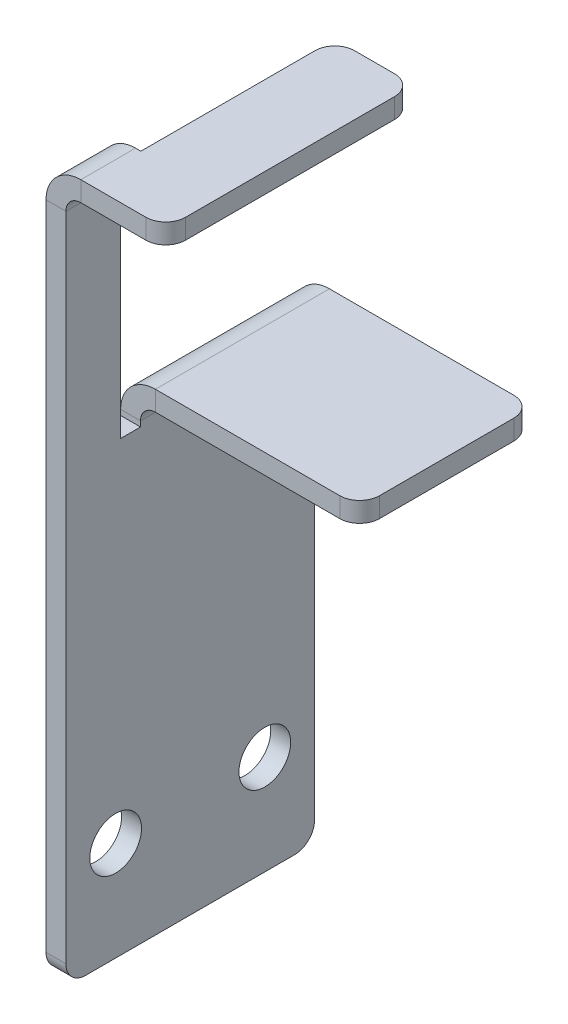
ISO-10303-21;
HEADER;
FILE_DESCRIPTION(('STEP AP214'),'2;1');
FILE_NAME('part.step','',(''),(''),'','','');
FILE_SCHEMA(('AUTOMOTIVE_DESIGN { 1 0 10303 214 1 1 1 1 }'));
ENDSEC;
DATA;
#1=APPLICATION_CONTEXT('core data for automotive mechanical design processes');
#2=APPLICATION_PROTOCOL_DEFINITION('international standard','automotive_design',2000,#1);
#3=PRODUCT_CONTEXT('',#1,'mechanical');
#4=PRODUCT('Part','Part','',(#3));
#5=PRODUCT_RELATED_PRODUCT_CATEGORY('part','',(#4));
#6=PRODUCT_DEFINITION_FORMATION('','',#4);
#7=PRODUCT_DEFINITION_CONTEXT('part definition',#1,'design');
#8=PRODUCT_DEFINITION('design','',#6,#7);
#9=PRODUCT_DEFINITION_SHAPE('','',#8);
#10=(LENGTH_UNIT() NAMED_UNIT(*) SI_UNIT(.MILLI.,.METRE.));
#11=(NAMED_UNIT(*) PLANE_ANGLE_UNIT() SI_UNIT($,.RADIAN.));
#12=(NAMED_UNIT(*) SI_UNIT($,.STERADIAN.) SOLID_ANGLE_UNIT());
#13=UNCERTAINTY_MEASURE_WITH_UNIT(LENGTH_MEASURE(1.E-05),#10,'distance_accuracy_value','');
#14=(GEOMETRIC_REPRESENTATION_CONTEXT(3) GLOBAL_UNCERTAINTY_ASSIGNED_CONTEXT((#13)) GLOBAL_UNIT_ASSIGNED_CONTEXT((#10,
#11,#12)) REPRESENTATION_CONTEXT('',''));
#15=CARTESIAN_POINT('',(0.,0.,0.));
#16=DIRECTION('',(0.,0.,1.));
#17=DIRECTION('',(1.,0.,0.));
#18=AXIS2_PLACEMENT_3D('',#15,#16,#17);
#19=CARTESIAN_POINT('',(-2.54,0.,0.));
#20=DIRECTION('',(0.,0.,1.));
#21=DIRECTION('',(1.,0.,0.));
#22=AXIS2_PLACEMENT_3D('',#19,#20,#21);
#23=PLANE('',#22);
#24=DIRECTION('',(0.,-1.,0.));
#25=VECTOR('',#24,1.);
#26=CARTESIAN_POINT('',(0.,0.,0.));
#27=LINE('',#26,#25);
#28=CARTESIAN_POINT('',(0.,85.7713608312131,0.));
#29=VERTEX_POINT('',#28);
#30=CARTESIAN_POINT('',(0.,2.54,0.));
#31=VERTEX_POINT('',#30);
#32=EDGE_CURVE('E72',#29,#31,#27,.T.);
#33=ORIENTED_EDGE('',*,*,#32,.F.);
#34=DIRECTION('',(-1.,0.,0.));
#35=VECTOR('',#34,1.);
#36=CARTESIAN_POINT('',(-2.54,85.7713608312131,0.));
#37=LINE('',#36,#35);
#38=CARTESIAN_POINT('',(-2.54,85.7713608312131,0.));
#39=VERTEX_POINT('',#38);
#40=EDGE_CURVE('E422',#29,#39,#37,.T.);
#41=ORIENTED_EDGE('',*,*,#40,.T.);
#42=DIRECTION('',(0.,-1.,0.));
#43=VECTOR('',#42,1.);
#44=CARTESIAN_POINT('',(-2.54,0.,0.));
#45=LINE('',#44,#43);
#46=CARTESIAN_POINT('',(-2.54,2.54,0.));
#47=VERTEX_POINT('',#46);
#48=EDGE_CURVE('E362',#39,#47,#45,.T.);
#49=ORIENTED_EDGE('',*,*,#48,.T.);
#50=DIRECTION('',(1.,0.,0.));
#51=VECTOR('',#50,1.);
#52=CARTESIAN_POINT('',(-2.54,2.54,0.));
#53=LINE('',#52,#51);
#54=EDGE_CURVE('E360',#47,#31,#53,.T.);
#55=ORIENTED_EDGE('',*,*,#54,.T.);
#56=EDGE_LOOP('',(#33,#41,#49,#55));
#57=FACE_BOUND('',#56,.T.);
#58=ADVANCED_FACE('F47',(#57),#23,.T.);
#59=CARTESIAN_POINT('',(-2.54,0.,0.));
#60=DIRECTION('',(-1.,0.,0.));
#61=DIRECTION('',(0.,0.,1.));
#62=AXIS2_PLACEMENT_3D('',#59,#60,#61);
#63=PLANE('',#62);
#64=CARTESIAN_POINT('',(-2.54,12.7,-25.4));
#65=DIRECTION('',(1.,0.,0.));
#66=DIRECTION('',(0.,0.,-1.));
#67=AXIS2_PLACEMENT_3D('',#64,#65,#66);
#68=CIRCLE('',#67,3.302);
#69=CARTESIAN_POINT('',(-2.54,12.7,-28.702));
#70=VERTEX_POINT('',#69);
#71=EDGE_CURVE('E343',#70,#70,#68,.T.);
#72=ORIENTED_EDGE('',*,*,#71,.T.);
#73=EDGE_LOOP('',(#72));
#74=FACE_BOUND('',#73,.T.);
#75=CARTESIAN_POINT('',(-2.54,12.7,-6.35));
#76=DIRECTION('',(1.,0.,0.));
#77=DIRECTION('',(0.,0.,-1.));
#78=AXIS2_PLACEMENT_3D('',#75,#76,#77);
#79=CIRCLE('',#78,3.302);
#80=CARTESIAN_POINT('',(-2.54,12.7,-9.652));
#81=VERTEX_POINT('',#80);
#82=EDGE_CURVE('E340',#81,#81,#79,.T.);
#83=ORIENTED_EDGE('',*,*,#82,.T.);
#84=EDGE_LOOP('',(#83));
#85=FACE_BOUND('',#84,.T.);
#86=ORIENTED_EDGE('',*,*,#48,.F.);
#87=DIRECTION('',(0.,0.,-1.));
#88=VECTOR('',#87,1.);
#89=CARTESIAN_POINT('',(-2.54,85.7713608312131,0.));
#90=LINE('',#89,#88);
#91=CARTESIAN_POINT('',(-2.54,85.7713608312131,-6.985));
#92=VERTEX_POINT('',#91);
#93=EDGE_CURVE('E415',#39,#92,#90,.T.);
#94=ORIENTED_EDGE('',*,*,#93,.T.);
#95=DIRECTION('',(0.,-1.,0.));
#96=VECTOR('',#95,1.);
#97=CARTESIAN_POINT('',(-2.54,91.44,-6.985));
#98=LINE('',#97,#96);
#99=CARTESIAN_POINT('',(-2.54,57.15,-6.985));
#100=VERTEX_POINT('',#99);
#101=EDGE_CURVE('E328',#92,#100,#98,.T.);
#102=ORIENTED_EDGE('',*,*,#101,.T.);
#103=DIRECTION('',(0.,0.,-1.));
#104=VECTOR('',#103,1.);
#105=CARTESIAN_POINT('',(-2.54,57.15,-9.52500000000001));
#106=LINE('',#105,#104);
#107=CARTESIAN_POINT('',(-2.54,57.15,-9.52500000000001));
#108=VERTEX_POINT('',#107);
#109=EDGE_CURVE('E325',#100,#108,#106,.T.);
#110=ORIENTED_EDGE('',*,*,#109,.T.);
#111=DIRECTION('',(0.,1.,0.));
#112=VECTOR('',#111,1.);
#113=CARTESIAN_POINT('',(-2.54,86.36,-9.52500000000001));
#114=LINE('',#113,#112);
#115=CARTESIAN_POINT('',(-2.54,57.8313608312131,-9.52500000000001));
#116=VERTEX_POINT('',#115);
#117=EDGE_CURVE('E337',#108,#116,#114,.T.);
#118=ORIENTED_EDGE('',*,*,#117,.T.);
#119=DIRECTION('',(0.,0.,-1.));
#120=VECTOR('',#119,1.);
#121=CARTESIAN_POINT('',(-2.54,57.8313608312131,0.));
#122=LINE('',#121,#120);
#123=CARTESIAN_POINT('',(-2.54,57.8313608312131,-31.75));
#124=VERTEX_POINT('',#123);
#125=EDGE_CURVE('E334',#116,#124,#122,.T.);
#126=ORIENTED_EDGE('',*,*,#125,.T.);
#127=DIRECTION('',(0.,1.,0.));
#128=VECTOR('',#127,1.);
#129=CARTESIAN_POINT('',(-2.54,0.,-31.75));
#130=LINE('',#129,#128);
#131=CARTESIAN_POINT('',(-2.54,2.54,-31.75));
#132=VERTEX_POINT('',#131);
#133=EDGE_CURVE('E51',#132,#124,#130,.T.);
#134=ORIENTED_EDGE('',*,*,#133,.F.);
#135=CARTESIAN_POINT('',(-2.54,2.54,-29.21));
#136=DIRECTION('',(-1.,0.,0.));
#137=DIRECTION('',(0.,0.,1.));
#138=AXIS2_PLACEMENT_3D('',#135,#136,#137);
#139=CIRCLE('',#138,2.54);
#140=CARTESIAN_POINT('',(-2.54,0.,-29.21));
#141=VERTEX_POINT('',#140);
#142=EDGE_CURVE('E332',#132,#141,#139,.T.);
#143=ORIENTED_EDGE('',*,*,#142,.T.);
#144=DIRECTION('',(0.,0.,-1.));
#145=VECTOR('',#144,1.);
#146=CARTESIAN_POINT('',(-2.54,0.,0.));
#147=LINE('',#146,#145);
#148=CARTESIAN_POINT('',(-2.54,0.,-2.54));
#149=VERTEX_POINT('',#148);
#150=EDGE_CURVE('E357',#149,#141,#147,.T.);
#151=ORIENTED_EDGE('',*,*,#150,.F.);
#152=CARTESIAN_POINT('',(-2.54,2.54,-2.54));
#153=DIRECTION('',(-1.,0.,0.));
#154=DIRECTION('',(0.,0.,1.));
#155=AXIS2_PLACEMENT_3D('',#152,#153,#154);
#156=CIRCLE('',#155,2.54);
#157=EDGE_CURVE('E329',#149,#47,#156,.T.);
#158=ORIENTED_EDGE('',*,*,#157,.T.);
#159=EDGE_LOOP('',(#86,#94,#102,#110,#118,#126,#134,#143,#151,#158));
#160=FACE_BOUND('',#159,.T.);
#161=ADVANCED_FACE('F432',(#74,#85,#160),#63,.T.);
#162=CARTESIAN_POINT('',(25.4463608312131,62.276360831213,-9.52500000000001));
#163=DIRECTION('',(0.,0.,-1.));
#164=DIRECTION('',(1.,0.,0.));
#165=AXIS2_PLACEMENT_3D('',#162,#163,#164);
#166=PLANE('',#165);
#167=DIRECTION('',(1.,0.,0.));
#168=VECTOR('',#167,1.);
#169=CARTESIAN_POINT('',(25.4463608312131,62.276360831213,-9.52500000000001));
#170=LINE('',#169,#168);
#171=CARTESIAN_POINT('',(1.90500000000002,62.2763608312131,-9.52500000000001));
#172=VERTEX_POINT('',#171);
#173=CARTESIAN_POINT('',(25.4463608312131,62.276360831213,-9.52500000000001));
#174=VERTEX_POINT('',#173);
#175=EDGE_CURVE('E377',#172,#174,#170,.T.);
#176=ORIENTED_EDGE('',*,*,#175,.F.);
#177=DIRECTION('',(0.,-1.,0.));
#178=VECTOR('',#177,1.);
#179=CARTESIAN_POINT('',(1.90500000000002,62.2763608312131,-9.52500000000001));
#180=LINE('',#179,#178);
#181=CARTESIAN_POINT('',(1.905,59.7363608312131,-9.52500000000001));
#182=VERTEX_POINT('',#181);
#183=EDGE_CURVE('E412',#172,#182,#180,.T.);
#184=ORIENTED_EDGE('',*,*,#183,.T.);
#185=DIRECTION('',(1.,0.,0.));
#186=VECTOR('',#185,1.);
#187=CARTESIAN_POINT('',(25.4463608312131,59.736360831213,-9.52500000000001));
#188=LINE('',#187,#186);
#189=CARTESIAN_POINT('',(25.4463608312131,59.736360831213,-9.52500000000001));
#190=VERTEX_POINT('',#189);
#191=EDGE_CURVE('E309',#182,#190,#188,.T.);
#192=ORIENTED_EDGE('',*,*,#191,.T.);
#193=DIRECTION('',(0.,-1.,0.));
#194=VECTOR('',#193,1.);
#195=CARTESIAN_POINT('',(25.4463608312131,62.276360831213,-9.52500000000001));
#196=LINE('',#195,#194);
#197=EDGE_CURVE('E380',#174,#190,#196,.T.);
#198=ORIENTED_EDGE('',*,*,#197,.F.);
#199=EDGE_LOOP('',(#176,#184,#192,#198));
#200=FACE_BOUND('',#199,.T.);
#201=ADVANCED_FACE('F532',(#200),#166,.F.);
#202=CARTESIAN_POINT('',(-60.9136391687869,59.7363608312133,0.));
#203=DIRECTION('',(0.,1.,0.));
#204=DIRECTION('',(0.,0.,1.));
#205=AXIS2_PLACEMENT_3D('',#202,#203,#204);
#206=PLANE('',#205);
#207=ORIENTED_EDGE('',*,*,#191,.F.);
#208=DIRECTION('',(0.,0.,-1.));
#209=VECTOR('',#208,1.);
#210=CARTESIAN_POINT('',(1.905,59.7363608312131,0.));
#211=LINE('',#210,#209);
#212=CARTESIAN_POINT('',(1.905,59.7363608312131,-31.75));
#213=VERTEX_POINT('',#212);
#214=EDGE_CURVE('E409',#182,#213,#211,.T.);
#215=ORIENTED_EDGE('',*,*,#214,.T.);
#216=DIRECTION('',(1.,0.,0.));
#217=VECTOR('',#216,1.);
#218=CARTESIAN_POINT('',(-60.9136391687869,59.7363608312133,-31.75));
#219=LINE('',#218,#217);
#220=CARTESIAN_POINT('',(25.4463608312131,59.736360831213,-31.75));
#221=VERTEX_POINT('',#220);
#222=EDGE_CURVE('E389',#213,#221,#219,.T.);
#223=ORIENTED_EDGE('',*,*,#222,.T.);
#224=CARTESIAN_POINT('',(25.4463608312131,59.736360831213,-29.21));
#225=DIRECTION('',(0.,1.,0.));
#226=DIRECTION('',(0.,0.,1.));
#227=AXIS2_PLACEMENT_3D('',#224,#225,#226);
#228=CIRCLE('',#227,2.54);
#229=CARTESIAN_POINT('',(27.9863608312131,59.736360831213,-29.21));
#230=VERTEX_POINT('',#229);
#231=EDGE_CURVE('E395',#221,#230,#228,.F.);
#232=ORIENTED_EDGE('',*,*,#231,.T.);
#233=DIRECTION('',(0.,0.,-1.));
#234=VECTOR('',#233,1.);
#235=CARTESIAN_POINT('',(27.9863608312131,59.736360831213,-31.75));
#236=LINE('',#235,#234);
#237=CARTESIAN_POINT('',(27.9863608312131,59.736360831213,-12.065));
#238=VERTEX_POINT('',#237);
#239=EDGE_CURVE('E384',#238,#230,#236,.T.);
#240=ORIENTED_EDGE('',*,*,#239,.F.);
#241=CARTESIAN_POINT('',(25.4463608312131,59.736360831213,-12.065));
#242=DIRECTION('',(0.,1.,0.));
#243=DIRECTION('',(0.,0.,-1.));
#244=AXIS2_PLACEMENT_3D('',#241,#242,#243);
#245=CIRCLE('',#244,2.54);
#246=EDGE_CURVE('E381',#190,#238,#245,.T.);
#247=ORIENTED_EDGE('',*,*,#246,.F.);
#248=EDGE_LOOP('',(#207,#215,#223,#232,#240,#247));
#249=FACE_BOUND('',#248,.T.);
#250=ADVANCED_FACE('F583',(#249),#206,.F.);
#251=CARTESIAN_POINT('',(-60.9136391687869,62.2763608312133,-31.75));
#252=DIRECTION('',(0.,0.,-1.));
#253=DIRECTION('',(0.,1.,0.));
#254=AXIS2_PLACEMENT_3D('',#251,#252,#253);
#255=PLANE('',#254);
#256=DIRECTION('',(0.,-1.,0.));
#257=VECTOR('',#256,1.);
#258=CARTESIAN_POINT('',(1.90500000000002,62.2763608312131,-31.75));
#259=LINE('',#258,#257);
#260=CARTESIAN_POINT('',(1.90500000000002,62.2763608312131,-31.75));
#261=VERTEX_POINT('',#260);
#262=EDGE_CURVE('E406',#261,#213,#259,.T.);
#263=ORIENTED_EDGE('',*,*,#262,.F.);
#264=DIRECTION('',(1.,0.,0.));
#265=VECTOR('',#264,1.);
#266=CARTESIAN_POINT('',(-60.9136391687869,62.2763608312133,-31.75));
#267=LINE('',#266,#265);
#268=CARTESIAN_POINT('',(25.4463608312131,62.276360831213,-31.75));
#269=VERTEX_POINT('',#268);
#270=EDGE_CURVE('E396',#261,#269,#267,.T.);
#271=ORIENTED_EDGE('',*,*,#270,.T.);
#272=DIRECTION('',(0.,-1.,0.));
#273=VECTOR('',#272,1.);
#274=CARTESIAN_POINT('',(25.4463608312131,59.736360831213,-31.75));
#275=LINE('',#274,#273);
#276=EDGE_CURVE('E392',#269,#221,#275,.T.);
#277=ORIENTED_EDGE('',*,*,#276,.T.);
#278=ORIENTED_EDGE('',*,*,#222,.F.);
#279=EDGE_LOOP('',(#263,#271,#277,#278));
#280=FACE_BOUND('',#279,.T.);
#281=ADVANCED_FACE('F579',(#280),#255,.T.);
#282=CARTESIAN_POINT('',(-60.9136391687869,62.2763608312133,0.));
#283=DIRECTION('',(0.,1.,0.));
#284=DIRECTION('',(0.,0.,1.));
#285=AXIS2_PLACEMENT_3D('',#282,#283,#284);
#286=PLANE('',#285);
#287=DIRECTION('',(0.,0.,-1.));
#288=VECTOR('',#287,1.);
#289=CARTESIAN_POINT('',(1.90500000000002,62.2763608312131,0.));
#290=LINE('',#289,#288);
#291=EDGE_CURVE('E403',#172,#261,#290,.T.);
#292=ORIENTED_EDGE('',*,*,#291,.F.);
#293=ORIENTED_EDGE('',*,*,#175,.T.);
#294=CARTESIAN_POINT('',(25.4463608312131,62.276360831213,-12.065));
#295=DIRECTION('',(0.,1.,0.));
#296=DIRECTION('',(0.,0.,-1.));
#297=AXIS2_PLACEMENT_3D('',#294,#295,#296);
#298=CIRCLE('',#297,2.54);
#299=CARTESIAN_POINT('',(27.9863608312131,62.276360831213,-12.065));
#300=VERTEX_POINT('',#299);
#301=EDGE_CURVE('E373',#174,#300,#298,.T.);
#302=ORIENTED_EDGE('',*,*,#301,.T.);
#303=DIRECTION('',(0.,0.,-1.));
#304=VECTOR('',#303,1.);
#305=CARTESIAN_POINT('',(27.9863608312131,62.276360831213,-31.75));
#306=LINE('',#305,#304);
#307=CARTESIAN_POINT('',(27.9863608312131,62.276360831213,-29.21));
#308=VERTEX_POINT('',#307);
#309=EDGE_CURVE('E376',#300,#308,#306,.T.);
#310=ORIENTED_EDGE('',*,*,#309,.T.);
#311=CARTESIAN_POINT('',(25.4463608312131,62.276360831213,-29.21));
#312=DIRECTION('',(0.,1.,0.));
#313=DIRECTION('',(0.,0.,1.));
#314=AXIS2_PLACEMENT_3D('',#311,#312,#313);
#315=CIRCLE('',#314,2.54);
#316=EDGE_CURVE('E400',#308,#269,#315,.T.);
#317=ORIENTED_EDGE('',*,*,#316,.T.);
#318=ORIENTED_EDGE('',*,*,#270,.F.);
#319=EDGE_LOOP('',(#292,#293,#302,#310,#317,#318));
#320=FACE_BOUND('',#319,.T.);
#321=ADVANCED_FACE('F568',(#320),#286,.T.);
#322=CARTESIAN_POINT('',(27.9863608312131,62.276360831213,-31.75));
#323=DIRECTION('',(-1.,0.,0.));
#324=DIRECTION('',(0.,0.,-1.));
#325=AXIS2_PLACEMENT_3D('',#322,#323,#324);
#326=PLANE('',#325);
#327=ORIENTED_EDGE('',*,*,#239,.T.);
#328=DIRECTION('',(0.,-1.,0.));
#329=VECTOR('',#328,1.);
#330=CARTESIAN_POINT('',(27.9863608312131,62.276360831213,-29.21));
#331=LINE('',#330,#329);
#332=EDGE_CURVE('E398',#230,#308,#331,.F.);
#333=ORIENTED_EDGE('',*,*,#332,.T.);
#334=ORIENTED_EDGE('',*,*,#309,.F.);
#335=DIRECTION('',(0.,-1.,0.));
#336=VECTOR('',#335,1.);
#337=CARTESIAN_POINT('',(27.9863608312131,62.276360831213,-12.065));
#338=LINE('',#337,#336);
#339=EDGE_CURVE('E387',#300,#238,#338,.T.);
#340=ORIENTED_EDGE('',*,*,#339,.T.);
#341=EDGE_LOOP('',(#327,#333,#334,#340));
#342=FACE_BOUND('',#341,.T.);
#343=ADVANCED_FACE('F564',(#342),#326,.F.);
#344=CARTESIAN_POINT('',(25.4463608312131,62.276360831213,-12.065));
#345=DIRECTION('',(0.,-1.,0.));
#346=DIRECTION('',(0.,0.,-1.));
#347=AXIS2_PLACEMENT_3D('',#344,#345,#346);
#348=CYLINDRICAL_SURFACE('',#347,2.54);
#349=ORIENTED_EDGE('',*,*,#246,.T.);
#350=ORIENTED_EDGE('',*,*,#339,.F.);
#351=ORIENTED_EDGE('',*,*,#301,.F.);
#352=ORIENTED_EDGE('',*,*,#197,.T.);
#353=EDGE_LOOP('',(#349,#350,#351,#352));
#354=FACE_BOUND('',#353,.T.);
#355=ADVANCED_FACE('F567',(#354),#348,.T.);
#356=CARTESIAN_POINT('',(25.4463608312131,62.276360831213,-29.21));
#357=DIRECTION('',(0.,1.,0.));
#358=DIRECTION('',(0.,0.,1.));
#359=AXIS2_PLACEMENT_3D('',#356,#357,#358);
#360=CYLINDRICAL_SURFACE('',#359,2.54);
#361=ORIENTED_EDGE('',*,*,#316,.F.);
#362=ORIENTED_EDGE('',*,*,#332,.F.);
#363=ORIENTED_EDGE('',*,*,#231,.F.);
#364=ORIENTED_EDGE('',*,*,#276,.F.);
#365=EDGE_LOOP('',(#361,#362,#363,#364));
#366=FACE_BOUND('',#365,.T.);
#367=ADVANCED_FACE('F572',(#366),#360,.T.);
#368=CARTESIAN_POINT('',(-2.54,57.15,-9.52500000000001));
#369=DIRECTION('',(0.,-1.,0.));
#370=DIRECTION('',(0.,0.,-1.));
#371=AXIS2_PLACEMENT_3D('',#368,#369,#370);
#372=PLANE('',#371);
#373=DIRECTION('',(0.,0.,-1.));
#374=VECTOR('',#373,1.);
#375=CARTESIAN_POINT('',(0.,57.15,-9.52500000000001));
#376=LINE('',#375,#374);
#377=CARTESIAN_POINT('',(0.,57.15,-6.985));
#378=VERTEX_POINT('',#377);
#379=CARTESIAN_POINT('',(0.,57.15,-9.52500000000001));
#380=VERTEX_POINT('',#379);
#381=EDGE_CURVE('E366',#378,#380,#376,.T.);
#382=ORIENTED_EDGE('',*,*,#381,.T.);
#383=DIRECTION('',(1.,0.,0.));
#384=VECTOR('',#383,1.);
#385=CARTESIAN_POINT('',(-2.54,57.15,-9.52500000000001));
#386=LINE('',#385,#384);
#387=EDGE_CURVE('E310',#108,#380,#386,.T.);
#388=ORIENTED_EDGE('',*,*,#387,.F.);
#389=ORIENTED_EDGE('',*,*,#109,.F.);
#390=DIRECTION('',(1.,0.,0.));
#391=VECTOR('',#390,1.);
#392=CARTESIAN_POINT('',(-2.54,57.15,-6.985));
#393=LINE('',#392,#391);
#394=EDGE_CURVE('E363',#100,#378,#393,.T.);
#395=ORIENTED_EDGE('',*,*,#394,.T.);
#396=EDGE_LOOP('',(#382,#388,#389,#395));
#397=FACE_BOUND('',#396,.T.);
#398=ADVANCED_FACE('F437',(#397),#372,.F.);
#399=CARTESIAN_POINT('',(-2.54,91.44,-6.985));
#400=DIRECTION('',(0.,0.,1.));
#401=DIRECTION('',(1.,0.,0.));
#402=AXIS2_PLACEMENT_3D('',#399,#400,#401);
#403=PLANE('',#402);
#404=DIRECTION('',(-1.,0.,0.));
#405=VECTOR('',#404,1.);
#406=CARTESIAN_POINT('',(-2.54,85.7713608312131,-6.985));
#407=LINE('',#406,#405);
#408=CARTESIAN_POINT('',(0.,85.7713608312131,-6.985));
#409=VERTEX_POINT('',#408);
#410=EDGE_CURVE('E12',#409,#92,#407,.T.);
#411=ORIENTED_EDGE('',*,*,#410,.F.);
#412=DIRECTION('',(0.,-1.,0.));
#413=VECTOR('',#412,1.);
#414=CARTESIAN_POINT('',(0.,91.44,-6.985));
#415=LINE('',#414,#413);
#416=EDGE_CURVE('E64',#409,#378,#415,.T.);
#417=ORIENTED_EDGE('',*,*,#416,.T.);
#418=ORIENTED_EDGE('',*,*,#394,.F.);
#419=ORIENTED_EDGE('',*,*,#101,.F.);
#420=EDGE_LOOP('',(#411,#417,#418,#419));
#421=FACE_BOUND('',#420,.T.);
#422=ADVANCED_FACE('F49',(#421),#403,.F.);
#423=CARTESIAN_POINT('',(-2.54,2.54,-2.54));
#424=DIRECTION('',(1.,0.,0.));
#425=DIRECTION('',(0.,0.,-1.));
#426=AXIS2_PLACEMENT_3D('',#423,#424,#425);
#427=CYLINDRICAL_SURFACE('',#426,2.54);
#428=ORIENTED_EDGE('',*,*,#157,.F.);
#429=DIRECTION('',(1.,0.,0.));
#430=VECTOR('',#429,1.);
#431=CARTESIAN_POINT('',(-2.54,0.,-2.54));
#432=LINE('',#431,#430);
#433=CARTESIAN_POINT('',(0.,0.,-2.54));
#434=VERTEX_POINT('',#433);
#435=EDGE_CURVE('E352',#434,#149,#432,.F.);
#436=ORIENTED_EDGE('',*,*,#435,.F.);
#437=CARTESIAN_POINT('',(0.,2.54,-2.54));
#438=DIRECTION('',(-1.,0.,0.));
#439=DIRECTION('',(0.,0.,1.));
#440=AXIS2_PLACEMENT_3D('',#437,#438,#439);
#441=CIRCLE('',#440,2.54);
#442=EDGE_CURVE('E318',#31,#434,#441,.F.);
#443=ORIENTED_EDGE('',*,*,#442,.F.);
#444=ORIENTED_EDGE('',*,*,#54,.F.);
#445=EDGE_LOOP('',(#428,#436,#443,#444));
#446=FACE_BOUND('',#445,.T.);
#447=ADVANCED_FACE('F463',(#446),#427,.T.);
#448=CARTESIAN_POINT('',(-2.54,0.,0.));
#449=DIRECTION('',(0.,-1.,0.));
#450=DIRECTION('',(0.,0.,-1.));
#451=AXIS2_PLACEMENT_3D('',#448,#449,#450);
#452=PLANE('',#451);
#453=ORIENTED_EDGE('',*,*,#150,.T.);
#454=DIRECTION('',(1.,0.,0.));
#455=VECTOR('',#454,1.);
#456=CARTESIAN_POINT('',(-2.54,0.,-29.21));
#457=LINE('',#456,#455);
#458=CARTESIAN_POINT('',(0.,0.,-29.21));
#459=VERTEX_POINT('',#458);
#460=EDGE_CURVE('E354',#141,#459,#457,.T.);
#461=ORIENTED_EDGE('',*,*,#460,.T.);
#462=DIRECTION('',(0.,0.,-1.));
#463=VECTOR('',#462,1.);
#464=CARTESIAN_POINT('',(0.,0.,0.));
#465=LINE('',#464,#463);
#466=EDGE_CURVE('E315',#434,#459,#465,.T.);
#467=ORIENTED_EDGE('',*,*,#466,.F.);
#468=ORIENTED_EDGE('',*,*,#435,.T.);
#469=EDGE_LOOP('',(#453,#461,#467,#468));
#470=FACE_BOUND('',#469,.T.);
#471=ADVANCED_FACE('F458',(#470),#452,.T.);
#472=CARTESIAN_POINT('',(-2.54,2.54,-29.21));
#473=DIRECTION('',(1.,0.,0.));
#474=DIRECTION('',(0.,0.,-1.));
#475=AXIS2_PLACEMENT_3D('',#472,#473,#474);
#476=CYLINDRICAL_SURFACE('',#475,2.54);
#477=ORIENTED_EDGE('',*,*,#142,.F.);
#478=DIRECTION('',(1.,0.,0.));
#479=VECTOR('',#478,1.);
#480=CARTESIAN_POINT('',(-2.54,2.54,-31.75));
#481=LINE('',#480,#479);
#482=CARTESIAN_POINT('',(0.,2.54,-31.75));
#483=VERTEX_POINT('',#482);
#484=EDGE_CURVE('E320',#483,#132,#481,.F.);
#485=ORIENTED_EDGE('',*,*,#484,.F.);
#486=CARTESIAN_POINT('',(0.,2.54,-29.21));
#487=DIRECTION('',(-1.,0.,0.));
#488=DIRECTION('',(0.,0.,1.));
#489=AXIS2_PLACEMENT_3D('',#486,#487,#488);
#490=CIRCLE('',#489,2.54);
#491=EDGE_CURVE('E313',#459,#483,#490,.F.);
#492=ORIENTED_EDGE('',*,*,#491,.F.);
#493=ORIENTED_EDGE('',*,*,#460,.F.);
#494=EDGE_LOOP('',(#477,#485,#492,#493));
#495=FACE_BOUND('',#494,.T.);
#496=ADVANCED_FACE('F453',(#495),#476,.T.);
#497=CARTESIAN_POINT('',(-2.54,12.7,-6.35));
#498=DIRECTION('',(1.,0.,0.));
#499=DIRECTION('',(0.,0.,-1.));
#500=AXIS2_PLACEMENT_3D('',#497,#498,#499);
#501=CYLINDRICAL_SURFACE('',#500,3.302);
#502=ORIENTED_EDGE('',*,*,#82,.F.);
#503=EDGE_LOOP('',(#502));
#504=FACE_BOUND('',#503,.T.);
#505=CARTESIAN_POINT('',(0.,12.7,-6.35));
#506=DIRECTION('',(1.,0.,0.));
#507=DIRECTION('',(0.,0.,-1.));
#508=AXIS2_PLACEMENT_3D('',#505,#506,#507);
#509=CIRCLE('',#508,3.302);
#510=CARTESIAN_POINT('',(0.,12.7,-9.652));
#511=VERTEX_POINT('',#510);
#512=EDGE_CURVE('E349',#511,#511,#509,.T.);
#513=ORIENTED_EDGE('',*,*,#512,.T.);
#514=EDGE_LOOP('',(#513));
#515=FACE_BOUND('',#514,.T.);
#516=ADVANCED_FACE('F550',(#504,#515),#501,.F.);
#517=CARTESIAN_POINT('',(-2.54,12.7,-25.4));
#518=DIRECTION('',(1.,0.,0.));
#519=DIRECTION('',(0.,0.,-1.));
#520=AXIS2_PLACEMENT_3D('',#517,#518,#519);
#521=CYLINDRICAL_SURFACE('',#520,3.302);
#522=ORIENTED_EDGE('',*,*,#71,.F.);
#523=EDGE_LOOP('',(#522));
#524=FACE_BOUND('',#523,.T.);
#525=CARTESIAN_POINT('',(0.,12.7,-25.4));
#526=DIRECTION('',(1.,0.,0.));
#527=DIRECTION('',(0.,0.,-1.));
#528=AXIS2_PLACEMENT_3D('',#525,#526,#527);
#529=CIRCLE('',#528,3.302);
#530=CARTESIAN_POINT('',(0.,12.7,-28.702));
#531=VERTEX_POINT('',#530);
#532=EDGE_CURVE('E346',#531,#531,#529,.T.);
#533=ORIENTED_EDGE('',*,*,#532,.T.);
#534=EDGE_LOOP('',(#533));
#535=FACE_BOUND('',#534,.T.);
#536=ADVANCED_FACE('F544',(#524,#535),#521,.F.);
#537=CARTESIAN_POINT('',(-2.54,0.,-31.75));
#538=DIRECTION('',(0.,0.,-1.));
#539=DIRECTION('',(-1.,0.,0.));
#540=AXIS2_PLACEMENT_3D('',#537,#538,#539);
#541=PLANE('',#540);
#542=ORIENTED_EDGE('',*,*,#133,.T.);
#543=DIRECTION('',(1.,0.,0.));
#544=VECTOR('',#543,1.);
#545=CARTESIAN_POINT('',(-2.54,57.8313608312131,-31.75));
#546=LINE('',#545,#544);
#547=CARTESIAN_POINT('',(0.,57.8313608312131,-31.75));
#548=VERTEX_POINT('',#547);
#549=EDGE_CURVE('E322',#124,#548,#546,.T.);
#550=ORIENTED_EDGE('',*,*,#549,.T.);
#551=DIRECTION('',(0.,1.,0.));
#552=VECTOR('',#551,1.);
#553=CARTESIAN_POINT('',(0.,0.,-31.75));
#554=LINE('',#553,#552);
#555=EDGE_CURVE('E312',#483,#548,#554,.T.);
#556=ORIENTED_EDGE('',*,*,#555,.F.);
#557=ORIENTED_EDGE('',*,*,#484,.T.);
#558=EDGE_LOOP('',(#542,#550,#556,#557));
#559=FACE_BOUND('',#558,.T.);
#560=ADVANCED_FACE('F449',(#559),#541,.T.);
#561=CARTESIAN_POINT('',(0.,0.,0.));
#562=DIRECTION('',(-1.,0.,0.));
#563=DIRECTION('',(0.,0.,1.));
#564=AXIS2_PLACEMENT_3D('',#561,#562,#563);
#565=PLANE('',#564);
#566=DIRECTION('',(0.,0.,-1.));
#567=VECTOR('',#566,1.);
#568=CARTESIAN_POINT('',(0.,85.7713608312131,0.));
#569=LINE('',#568,#567);
#570=EDGE_CURVE('E56',#29,#409,#569,.T.);
#571=ORIENTED_EDGE('',*,*,#570,.F.);
#572=ORIENTED_EDGE('',*,*,#32,.T.);
#573=ORIENTED_EDGE('',*,*,#442,.T.);
#574=ORIENTED_EDGE('',*,*,#466,.T.);
#575=ORIENTED_EDGE('',*,*,#491,.T.);
#576=ORIENTED_EDGE('',*,*,#555,.T.);
#577=DIRECTION('',(0.,0.,-1.));
#578=VECTOR('',#577,1.);
#579=CARTESIAN_POINT('',(0.,57.8313608312131,0.));
#580=LINE('',#579,#578);
#581=CARTESIAN_POINT('',(0.,57.8313608312131,-9.52500000000001));
#582=VERTEX_POINT('',#581);
#583=EDGE_CURVE('E369',#582,#548,#580,.T.);
#584=ORIENTED_EDGE('',*,*,#583,.F.);
#585=DIRECTION('',(0.,1.,0.));
#586=VECTOR('',#585,1.);
#587=CARTESIAN_POINT('',(0.,86.36,-9.52500000000001));
#588=LINE('',#587,#586);
#589=EDGE_CURVE('E306',#380,#582,#588,.T.);
#590=ORIENTED_EDGE('',*,*,#589,.F.);
#591=ORIENTED_EDGE('',*,*,#381,.F.);
#592=ORIENTED_EDGE('',*,*,#416,.F.);
#593=EDGE_LOOP('',(#571,#572,#573,#574,#575,#576,#584,#590,#591,#592));
#594=FACE_BOUND('',#593,.T.);
#595=ORIENTED_EDGE('',*,*,#532,.F.);
#596=EDGE_LOOP('',(#595));
#597=FACE_BOUND('',#596,.T.);
#598=ORIENTED_EDGE('',*,*,#512,.F.);
#599=EDGE_LOOP('',(#598));
#600=FACE_BOUND('',#599,.T.);
#601=ADVANCED_FACE('F536',(#594,#597,#600),#565,.F.);
#602=CARTESIAN_POINT('',(-2.54,86.36,-9.52500000000001));
#603=DIRECTION('',(0.,0.,-1.));
#604=DIRECTION('',(0.,1.,0.));
#605=AXIS2_PLACEMENT_3D('',#602,#603,#604);
#606=PLANE('',#605);
#607=DIRECTION('',(1.,0.,0.));
#608=VECTOR('',#607,1.);
#609=CARTESIAN_POINT('',(-2.54,57.8313608312131,-9.52500000000001));
#610=LINE('',#609,#608);
#611=EDGE_CURVE('E302',#116,#582,#610,.T.);
#612=ORIENTED_EDGE('',*,*,#611,.F.);
#613=ORIENTED_EDGE('',*,*,#117,.F.);
#614=ORIENTED_EDGE('',*,*,#387,.T.);
#615=ORIENTED_EDGE('',*,*,#589,.T.);
#616=EDGE_LOOP('',(#612,#613,#614,#615));
#617=FACE_BOUND('',#616,.T.);
#618=ADVANCED_FACE('F442',(#617),#606,.F.);
#619=CARTESIAN_POINT('',(1.905,57.8313608312131,-9.52500000000001));
#620=DIRECTION('',(0.,0.,1.));
#621=DIRECTION('',(1.,0.,0.));
#622=AXIS2_PLACEMENT_3D('',#619,#620,#621);
#623=PLANE('',#622);
#624=ORIENTED_EDGE('',*,*,#611,.T.);
#625=CARTESIAN_POINT('',(1.905,57.8313608312131,-9.52500000000001));
#626=DIRECTION('',(0.,0.,-1.));
#627=DIRECTION('',(-1.,0.,0.));
#628=AXIS2_PLACEMENT_3D('',#625,#626,#627);
#629=CIRCLE('',#628,1.905);
#630=EDGE_CURVE('E288',#582,#182,#629,.T.);
#631=ORIENTED_EDGE('',*,*,#630,.T.);
#632=ORIENTED_EDGE('',*,*,#183,.F.);
#633=CARTESIAN_POINT('',(1.905,57.8313608312131,-9.52500000000001));
#634=DIRECTION('',(0.,0.,-1.));
#635=DIRECTION('',(-1.,0.,0.));
#636=AXIS2_PLACEMENT_3D('',#633,#634,#635);
#637=CIRCLE('',#636,4.445);
#638=EDGE_CURVE('E295',#116,#172,#637,.T.);
#639=ORIENTED_EDGE('',*,*,#638,.F.);
#640=EDGE_LOOP('',(#624,#631,#632,#639));
#641=FACE_BOUND('',#640,.T.);
#642=ADVANCED_FACE('F542',(#641),#623,.T.);
#643=CARTESIAN_POINT('',(1.905,57.8313608312131,-31.75));
#644=DIRECTION('',(0.,0.,-1.));
#645=DIRECTION('',(-1.,0.,0.));
#646=AXIS2_PLACEMENT_3D('',#643,#644,#645);
#647=PLANE('',#646);
#648=CARTESIAN_POINT('',(1.905,57.8313608312131,-31.75));
#649=DIRECTION('',(0.,0.,-1.));
#650=DIRECTION('',(-1.,0.,0.));
#651=AXIS2_PLACEMENT_3D('',#648,#649,#650);
#652=CIRCLE('',#651,1.905);
#653=EDGE_CURVE('E299',#213,#548,#652,.F.);
#654=ORIENTED_EDGE('',*,*,#653,.T.);
#655=ORIENTED_EDGE('',*,*,#549,.F.);
#656=CARTESIAN_POINT('',(1.905,57.8313608312131,-31.75));
#657=DIRECTION('',(0.,0.,1.));
#658=DIRECTION('',(-1.,0.,0.));
#659=AXIS2_PLACEMENT_3D('',#656,#657,#658);
#660=CIRCLE('',#659,4.445);
#661=EDGE_CURVE('E298',#261,#124,#660,.T.);
#662=ORIENTED_EDGE('',*,*,#661,.F.);
#663=ORIENTED_EDGE('',*,*,#262,.T.);
#664=EDGE_LOOP('',(#654,#655,#662,#663));
#665=FACE_BOUND('',#664,.T.);
#666=ADVANCED_FACE('F603',(#665),#647,.T.);
#667=CARTESIAN_POINT('',(1.905,57.8313608312131,2.28138239457658));
#668=DIRECTION('',(0.,0.,-1.));
#669=DIRECTION('',(-1.,0.,0.));
#670=AXIS2_PLACEMENT_3D('',#667,#668,#669);
#671=CYLINDRICAL_SURFACE('',#670,4.445);
#672=ORIENTED_EDGE('',*,*,#291,.T.);
#673=ORIENTED_EDGE('',*,*,#661,.T.);
#674=ORIENTED_EDGE('',*,*,#125,.F.);
#675=ORIENTED_EDGE('',*,*,#638,.T.);
#676=EDGE_LOOP('',(#672,#673,#674,#675));
#677=FACE_BOUND('',#676,.T.);
#678=ADVANCED_FACE('F599',(#677),#671,.T.);
#679=CARTESIAN_POINT('',(1.905,57.8313608312131,2.28138239457658));
#680=DIRECTION('',(0.,0.,-1.));
#681=DIRECTION('',(-1.,0.,0.));
#682=AXIS2_PLACEMENT_3D('',#679,#680,#681);
#683=CYLINDRICAL_SURFACE('',#682,1.905);
#684=ORIENTED_EDGE('',*,*,#214,.F.);
#685=ORIENTED_EDGE('',*,*,#630,.F.);
#686=ORIENTED_EDGE('',*,*,#583,.T.);
#687=ORIENTED_EDGE('',*,*,#653,.F.);
#688=EDGE_LOOP('',(#684,#685,#686,#687));
#689=FACE_BOUND('',#688,.T.);
#690=ADVANCED_FACE('F607',(#689),#683,.F.);
#691=CARTESIAN_POINT('',(1.905,85.7713608312131,0.));
#692=DIRECTION('',(0.,0.,1.));
#693=DIRECTION('',(1.,0.,0.));
#694=AXIS2_PLACEMENT_3D('',#691,#692,#693);
#695=PLANE('',#694);
#696=ORIENTED_EDGE('',*,*,#40,.F.);
#697=CARTESIAN_POINT('',(1.905,85.7713608312131,0.));
#698=DIRECTION('',(0.,0.,-1.));
#699=DIRECTION('',(-1.,0.,0.));
#700=AXIS2_PLACEMENT_3D('',#697,#698,#699);
#701=CIRCLE('',#700,1.905);
#702=CARTESIAN_POINT('',(1.905,87.6763608312131,0.));
#703=VERTEX_POINT('',#702);
#704=EDGE_CURVE('E289',#29,#703,#701,.T.);
#705=ORIENTED_EDGE('',*,*,#704,.T.);
#706=DIRECTION('',(0.,1.,0.));
#707=VECTOR('',#706,1.);
#708=CARTESIAN_POINT('',(1.90500000000002,90.2163608312131,0.));
#709=LINE('',#708,#707);
#710=CARTESIAN_POINT('',(1.90500000000002,90.2163608312131,0.));
#711=VERTEX_POINT('',#710);
#712=EDGE_CURVE('E236',#703,#711,#709,.T.);
#713=ORIENTED_EDGE('',*,*,#712,.T.);
#714=CARTESIAN_POINT('',(1.905,85.7713608312131,0.));
#715=DIRECTION('',(0.,0.,-1.));
#716=DIRECTION('',(1.,0.,0.));
#717=AXIS2_PLACEMENT_3D('',#714,#715,#716);
#718=CIRCLE('',#717,4.445);
#719=EDGE_CURVE('E281',#39,#711,#718,.T.);
#720=ORIENTED_EDGE('',*,*,#719,.F.);
#721=EDGE_LOOP('',(#696,#705,#713,#720));
#722=FACE_BOUND('',#721,.T.);
#723=ADVANCED_FACE('F472',(#722),#695,.T.);
#724=CARTESIAN_POINT('',(1.905,85.7713608312131,-6.985));
#725=DIRECTION('',(0.,0.,-1.));
#726=DIRECTION('',(-1.,0.,0.));
#727=AXIS2_PLACEMENT_3D('',#724,#725,#726);
#728=PLANE('',#727);
#729=CARTESIAN_POINT('',(1.905,85.7713608312131,-6.985));
#730=DIRECTION('',(0.,0.,-1.));
#731=DIRECTION('',(-1.,0.,0.));
#732=AXIS2_PLACEMENT_3D('',#729,#730,#731);
#733=CIRCLE('',#732,1.905);
#734=CARTESIAN_POINT('',(1.905,87.6763608312131,-6.985));
#735=VERTEX_POINT('',#734);
#736=EDGE_CURVE('E285',#735,#409,#733,.F.);
#737=ORIENTED_EDGE('',*,*,#736,.T.);
#738=ORIENTED_EDGE('',*,*,#410,.T.);
#739=CARTESIAN_POINT('',(1.905,85.7713608312131,-6.985));
#740=DIRECTION('',(0.,0.,1.));
#741=DIRECTION('',(1.,0.,0.));
#742=AXIS2_PLACEMENT_3D('',#739,#740,#741);
#743=CIRCLE('',#742,4.445);
#744=CARTESIAN_POINT('',(1.90500000000002,90.2163608312131,-6.985));
#745=VERTEX_POINT('',#744);
#746=EDGE_CURVE('E284',#745,#92,#743,.T.);
#747=ORIENTED_EDGE('',*,*,#746,.F.);
#748=DIRECTION('',(0.,1.,0.));
#749=VECTOR('',#748,1.);
#750=CARTESIAN_POINT('',(1.90500000000002,90.2163608312131,-6.985));
#751=LINE('',#750,#749);
#752=EDGE_CURVE('E489',#735,#745,#751,.T.);
#753=ORIENTED_EDGE('',*,*,#752,.F.);
#754=EDGE_LOOP('',(#737,#738,#747,#753));
#755=FACE_BOUND('',#754,.T.);
#756=ADVANCED_FACE('F621',(#755),#728,.T.);
#757=CARTESIAN_POINT('',(1.905,85.7713608312131,5.45818546070261));
#758=DIRECTION('',(0.,0.,-1.));
#759=DIRECTION('',(-1.,0.,0.));
#760=AXIS2_PLACEMENT_3D('',#757,#758,#759);
#761=CYLINDRICAL_SURFACE('',#760,4.445);
#762=DIRECTION('',(0.,0.,-1.));
#763=VECTOR('',#762,1.);
#764=CARTESIAN_POINT('',(1.90500000000002,90.2163608312131,0.));
#765=LINE('',#764,#763);
#766=EDGE_CURVE('E278',#711,#745,#765,.T.);
#767=ORIENTED_EDGE('',*,*,#766,.T.);
#768=ORIENTED_EDGE('',*,*,#746,.T.);
#769=ORIENTED_EDGE('',*,*,#93,.F.);
#770=ORIENTED_EDGE('',*,*,#719,.T.);
#771=EDGE_LOOP('',(#767,#768,#769,#770));
#772=FACE_BOUND('',#771,.T.);
#773=ADVANCED_FACE('F470',(#772),#761,.T.);
#774=CARTESIAN_POINT('',(1.905,85.7713608312131,5.45818546070261));
#775=DIRECTION('',(0.,0.,-1.));
#776=DIRECTION('',(-1.,0.,0.));
#777=AXIS2_PLACEMENT_3D('',#774,#775,#776);
#778=CYLINDRICAL_SURFACE('',#777,1.905);
#779=DIRECTION('',(0.,0.,-1.));
#780=VECTOR('',#779,1.);
#781=CARTESIAN_POINT('',(1.905,87.6763608312131,0.));
#782=LINE('',#781,#780);
#783=EDGE_CURVE('E238',#703,#735,#782,.T.);
#784=ORIENTED_EDGE('',*,*,#783,.F.);
#785=ORIENTED_EDGE('',*,*,#704,.F.);
#786=ORIENTED_EDGE('',*,*,#570,.T.);
#787=ORIENTED_EDGE('',*,*,#736,.F.);
#788=EDGE_LOOP('',(#784,#785,#786,#787));
#789=FACE_BOUND('',#788,.T.);
#790=ADVANCED_FACE('F474',(#789),#778,.F.);
#791=CARTESIAN_POINT('',(2.58636083121311,90.2163608312131,-31.75));
#792=DIRECTION('',(1.,0.,0.));
#793=DIRECTION('',(0.,0.,1.));
#794=AXIS2_PLACEMENT_3D('',#791,#792,#793);
#795=PLANE('',#794);
#796=DIRECTION('',(0.,0.,1.));
#797=VECTOR('',#796,1.);
#798=CARTESIAN_POINT('',(2.58636083121311,90.2163608312131,-31.75));
#799=LINE('',#798,#797);
#800=CARTESIAN_POINT('',(2.58636083121311,90.2163608312131,-29.21));
#801=VERTEX_POINT('',#800);
#802=CARTESIAN_POINT('',(2.58636083121311,90.2163608312131,-6.985));
#803=VERTEX_POINT('',#802);
#804=EDGE_CURVE('E248',#801,#803,#799,.T.);
#805=ORIENTED_EDGE('',*,*,#804,.F.);
#806=DIRECTION('',(0.,-1.,0.));
#807=VECTOR('',#806,1.);
#808=CARTESIAN_POINT('',(2.58636083121309,87.6763608312131,-29.21));
#809=LINE('',#808,#807);
#810=CARTESIAN_POINT('',(2.58636083121309,87.6763608312131,-29.21));
#811=VERTEX_POINT('',#810);
#812=EDGE_CURVE('E274',#801,#811,#809,.T.);
#813=ORIENTED_EDGE('',*,*,#812,.T.);
#814=DIRECTION('',(0.,0.,1.));
#815=VECTOR('',#814,1.);
#816=CARTESIAN_POINT('',(2.58636083121309,87.6763608312131,-31.75));
#817=LINE('',#816,#815);
#818=CARTESIAN_POINT('',(2.58636083121309,87.6763608312131,-6.985));
#819=VERTEX_POINT('',#818);
#820=EDGE_CURVE('E272',#811,#819,#817,.T.);
#821=ORIENTED_EDGE('',*,*,#820,.T.);
#822=DIRECTION('',(0.,-1.,0.));
#823=VECTOR('',#822,1.);
#824=CARTESIAN_POINT('',(2.58636083121311,90.2163608312131,-6.985));
#825=LINE('',#824,#823);
#826=EDGE_CURVE('E292',#803,#819,#825,.T.);
#827=ORIENTED_EDGE('',*,*,#826,.F.);
#828=EDGE_LOOP('',(#805,#813,#821,#827));
#829=FACE_BOUND('',#828,.T.);
#830=ADVANCED_FACE('F500',(#829),#795,.F.);
#831=CARTESIAN_POINT('',(5.12636083121311,90.2163608312131,-29.21));
#832=DIRECTION('',(0.,1.,0.));
#833=DIRECTION('',(0.,0.,1.));
#834=AXIS2_PLACEMENT_3D('',#831,#832,#833);
#835=CYLINDRICAL_SURFACE('',#834,2.54);
#836=CARTESIAN_POINT('',(5.12636083121311,90.2163608312131,-29.21));
#837=DIRECTION('',(0.,1.,0.));
#838=DIRECTION('',(0.,0.,1.));
#839=AXIS2_PLACEMENT_3D('',#836,#837,#838);
#840=CIRCLE('',#839,2.54);
#841=CARTESIAN_POINT('',(5.12636083121311,90.2163608312131,-31.75));
#842=VERTEX_POINT('',#841);
#843=EDGE_CURVE('E252',#842,#801,#840,.T.);
#844=ORIENTED_EDGE('',*,*,#843,.F.);
#845=DIRECTION('',(0.,-1.,0.));
#846=VECTOR('',#845,1.);
#847=CARTESIAN_POINT('',(5.12636083121311,90.2163608312131,-31.75));
#848=LINE('',#847,#846);
#849=CARTESIAN_POINT('',(5.12636083121309,87.6763608312131,-31.75));
#850=VERTEX_POINT('',#849);
#851=EDGE_CURVE('E264',#850,#842,#848,.F.);
#852=ORIENTED_EDGE('',*,*,#851,.F.);
#853=CARTESIAN_POINT('',(5.12636083121309,87.6763608312131,-29.21));
#854=DIRECTION('',(0.,1.,0.));
#855=DIRECTION('',(0.,0.,1.));
#856=AXIS2_PLACEMENT_3D('',#853,#854,#855);
#857=CIRCLE('',#856,2.54);
#858=EDGE_CURVE('E478',#811,#850,#857,.F.);
#859=ORIENTED_EDGE('',*,*,#858,.F.);
#860=ORIENTED_EDGE('',*,*,#812,.F.);
#861=EDGE_LOOP('',(#844,#852,#859,#860));
#862=FACE_BOUND('',#861,.T.);
#863=ADVANCED_FACE('F504',(#862),#835,.T.);
#864=CARTESIAN_POINT('',(-88.8536391687869,90.2163608312134,-31.75));
#865=DIRECTION('',(0.,0.,-1.));
#866=DIRECTION('',(0.,1.,0.));
#867=AXIS2_PLACEMENT_3D('',#864,#865,#866);
#868=PLANE('',#867);
#869=DIRECTION('',(1.,0.,0.));
#870=VECTOR('',#869,1.);
#871=CARTESIAN_POINT('',(-88.8536391687869,90.2163608312134,-31.75));
#872=LINE('',#871,#870);
#873=CARTESIAN_POINT('',(10.2063608312131,90.2163608312131,-31.75));
#874=VERTEX_POINT('',#873);
#875=EDGE_CURVE('E269',#842,#874,#872,.T.);
#876=ORIENTED_EDGE('',*,*,#875,.T.);
#877=DIRECTION('',(0.,-1.,0.));
#878=VECTOR('',#877,1.);
#879=CARTESIAN_POINT('',(10.2063608312131,90.2163608312131,-31.75));
#880=LINE('',#879,#878);
#881=CARTESIAN_POINT('',(10.2063608312131,87.6763608312131,-31.75));
#882=VERTEX_POINT('',#881);
#883=EDGE_CURVE('E266',#874,#882,#880,.T.);
#884=ORIENTED_EDGE('',*,*,#883,.T.);
#885=DIRECTION('',(1.,0.,0.));
#886=VECTOR('',#885,1.);
#887=CARTESIAN_POINT('',(-88.8536391687869,87.6763608312134,-31.75));
#888=LINE('',#887,#886);
#889=EDGE_CURVE('E480',#850,#882,#888,.T.);
#890=ORIENTED_EDGE('',*,*,#889,.F.);
#891=ORIENTED_EDGE('',*,*,#851,.T.);
#892=EDGE_LOOP('',(#876,#884,#890,#891));
#893=FACE_BOUND('',#892,.T.);
#894=ADVANCED_FACE('F508',(#893),#868,.T.);
#895=CARTESIAN_POINT('',(10.2063608312131,90.2163608312131,-29.21));
#896=DIRECTION('',(0.,-1.,0.));
#897=DIRECTION('',(0.,0.,-1.));
#898=AXIS2_PLACEMENT_3D('',#895,#896,#897);
#899=CYLINDRICAL_SURFACE('',#898,2.54);
#900=CARTESIAN_POINT('',(10.2063608312131,90.2163608312131,-29.21));
#901=DIRECTION('',(0.,1.,0.));
#902=DIRECTION('',(0.,0.,1.));
#903=AXIS2_PLACEMENT_3D('',#900,#901,#902);
#904=CIRCLE('',#903,2.54);
#905=CARTESIAN_POINT('',(12.7463608312131,90.2163608312131,-29.21));
#906=VERTEX_POINT('',#905);
#907=EDGE_CURVE('E254',#906,#874,#904,.T.);
#908=ORIENTED_EDGE('',*,*,#907,.F.);
#909=DIRECTION('',(0.,-1.,0.));
#910=VECTOR('',#909,1.);
#911=CARTESIAN_POINT('',(12.7463608312131,90.2163608312131,-29.21));
#912=LINE('',#911,#910);
#913=CARTESIAN_POINT('',(12.7463608312131,87.676360831213,-29.21));
#914=VERTEX_POINT('',#913);
#915=EDGE_CURVE('E257',#914,#906,#912,.F.);
#916=ORIENTED_EDGE('',*,*,#915,.F.);
#917=CARTESIAN_POINT('',(10.2063608312131,87.6763608312131,-29.21));
#918=DIRECTION('',(0.,1.,0.));
#919=DIRECTION('',(0.,0.,1.));
#920=AXIS2_PLACEMENT_3D('',#917,#918,#919);
#921=CIRCLE('',#920,2.54);
#922=EDGE_CURVE('E485',#882,#914,#921,.F.);
#923=ORIENTED_EDGE('',*,*,#922,.F.);
#924=ORIENTED_EDGE('',*,*,#883,.F.);
#925=EDGE_LOOP('',(#908,#916,#923,#924));
#926=FACE_BOUND('',#925,.T.);
#927=ADVANCED_FACE('F516',(#926),#899,.T.);
#928=CARTESIAN_POINT('',(12.7463608312131,90.2163608312131,0.));
#929=DIRECTION('',(1.,0.,0.));
#930=DIRECTION('',(0.,0.,1.));
#931=AXIS2_PLACEMENT_3D('',#928,#929,#930);
#932=PLANE('',#931);
#933=DIRECTION('',(0.,0.,1.));
#934=VECTOR('',#933,1.);
#935=CARTESIAN_POINT('',(12.7463608312131,90.2163608312131,0.));
#936=LINE('',#935,#934);
#937=CARTESIAN_POINT('',(12.7463608312131,90.2163608312131,-2.54));
#938=VERTEX_POINT('',#937);
#939=EDGE_CURVE('E261',#906,#938,#936,.T.);
#940=ORIENTED_EDGE('',*,*,#939,.T.);
#941=DIRECTION('',(0.,-1.,0.));
#942=VECTOR('',#941,1.);
#943=CARTESIAN_POINT('',(12.7463608312131,90.2163608312131,-2.54));
#944=LINE('',#943,#942);
#945=CARTESIAN_POINT('',(12.7463608312131,87.676360831213,-2.54));
#946=VERTEX_POINT('',#945);
#947=EDGE_CURVE('E259',#938,#946,#944,.T.);
#948=ORIENTED_EDGE('',*,*,#947,.T.);
#949=DIRECTION('',(0.,0.,1.));
#950=VECTOR('',#949,1.);
#951=CARTESIAN_POINT('',(12.7463608312131,87.676360831213,0.));
#952=LINE('',#951,#950);
#953=EDGE_CURVE('E223',#914,#946,#952,.T.);
#954=ORIENTED_EDGE('',*,*,#953,.F.);
#955=ORIENTED_EDGE('',*,*,#915,.T.);
#956=EDGE_LOOP('',(#940,#948,#954,#955));
#957=FACE_BOUND('',#956,.T.);
#958=ADVANCED_FACE('F518',(#957),#932,.T.);
#959=CARTESIAN_POINT('',(10.2063608312131,90.2163608312131,-2.54));
#960=DIRECTION('',(0.,-1.,0.));
#961=DIRECTION('',(0.,0.,-1.));
#962=AXIS2_PLACEMENT_3D('',#959,#960,#961);
#963=CYLINDRICAL_SURFACE('',#962,2.54);
#964=CARTESIAN_POINT('',(10.2063608312131,90.2163608312131,-2.54));
#965=DIRECTION('',(0.,1.,0.));
#966=DIRECTION('',(0.,0.,1.));
#967=AXIS2_PLACEMENT_3D('',#964,#965,#966);
#968=CIRCLE('',#967,2.54);
#969=CARTESIAN_POINT('',(10.2063608312131,90.2163608312131,0.));
#970=VERTEX_POINT('',#969);
#971=EDGE_CURVE('E243',#970,#938,#968,.T.);
#972=ORIENTED_EDGE('',*,*,#971,.F.);
#973=DIRECTION('',(0.,-1.,0.));
#974=VECTOR('',#973,1.);
#975=CARTESIAN_POINT('',(10.2063608312131,90.2163608312131,0.));
#976=LINE('',#975,#974);
#977=CARTESIAN_POINT('',(10.2063608312131,87.6763608312131,0.));
#978=VERTEX_POINT('',#977);
#979=EDGE_CURVE('E233',#978,#970,#976,.F.);
#980=ORIENTED_EDGE('',*,*,#979,.F.);
#981=CARTESIAN_POINT('',(10.2063608312131,87.6763608312131,-2.54));
#982=DIRECTION('',(0.,1.,0.));
#983=DIRECTION('',(0.,0.,1.));
#984=AXIS2_PLACEMENT_3D('',#981,#982,#983);
#985=CIRCLE('',#984,2.54);
#986=EDGE_CURVE('E216',#946,#978,#985,.F.);
#987=ORIENTED_EDGE('',*,*,#986,.F.);
#988=ORIENTED_EDGE('',*,*,#947,.F.);
#989=EDGE_LOOP('',(#972,#980,#987,#988));
#990=FACE_BOUND('',#989,.T.);
#991=ADVANCED_FACE('F242',(#990),#963,.T.);
#992=CARTESIAN_POINT('',(-88.8536391687869,90.2163608312134,0.));
#993=DIRECTION('',(0.,1.,0.));
#994=DIRECTION('',(0.,0.,1.));
#995=AXIS2_PLACEMENT_3D('',#992,#993,#994);
#996=PLANE('',#995);
#997=ORIENTED_EDGE('',*,*,#766,.F.);
#998=DIRECTION('',(-1.,0.,0.));
#999=VECTOR('',#998,1.);
#1000=CARTESIAN_POINT('',(-88.8536391687869,90.2163608312134,0.));
#1001=LINE('',#1000,#999);
#1002=EDGE_CURVE('E239',#970,#711,#1001,.T.);
#1003=ORIENTED_EDGE('',*,*,#1002,.F.);
#1004=ORIENTED_EDGE('',*,*,#971,.T.);
#1005=ORIENTED_EDGE('',*,*,#939,.F.);
#1006=ORIENTED_EDGE('',*,*,#907,.T.);
#1007=ORIENTED_EDGE('',*,*,#875,.F.);
#1008=ORIENTED_EDGE('',*,*,#843,.T.);
#1009=ORIENTED_EDGE('',*,*,#804,.T.);
#1010=DIRECTION('',(-1.,0.,0.));
#1011=VECTOR('',#1010,1.);
#1012=CARTESIAN_POINT('',(2.58636083121311,90.2163608312131,-6.985));
#1013=LINE('',#1012,#1011);
#1014=EDGE_CURVE('E244',#803,#745,#1013,.T.);
#1015=ORIENTED_EDGE('',*,*,#1014,.T.);
#1016=EDGE_LOOP('',(#997,#1003,#1004,#1005,#1006,#1007,#1008,#1009,#1015));
#1017=FACE_BOUND('',#1016,.T.);
#1018=ADVANCED_FACE('F511',(#1017),#996,.T.);
#1019=CARTESIAN_POINT('',(-88.8536391687869,90.2163608312134,0.));
#1020=DIRECTION('',(0.,0.,1.));
#1021=DIRECTION('',(0.,-1.,0.));
#1022=AXIS2_PLACEMENT_3D('',#1019,#1020,#1021);
#1023=PLANE('',#1022);
#1024=ORIENTED_EDGE('',*,*,#712,.F.);
#1025=DIRECTION('',(-1.,0.,0.));
#1026=VECTOR('',#1025,1.);
#1027=CARTESIAN_POINT('',(-88.8536391687869,87.6763608312134,0.));
#1028=LINE('',#1027,#1026);
#1029=EDGE_CURVE('E220',#978,#703,#1028,.T.);
#1030=ORIENTED_EDGE('',*,*,#1029,.F.);
#1031=ORIENTED_EDGE('',*,*,#979,.T.);
#1032=ORIENTED_EDGE('',*,*,#1002,.T.);
#1033=EDGE_LOOP('',(#1024,#1030,#1031,#1032));
#1034=FACE_BOUND('',#1033,.T.);
#1035=ADVANCED_FACE('F231',(#1034),#1023,.T.);
#1036=CARTESIAN_POINT('',(-88.8536391687869,87.6763608312134,0.));
#1037=DIRECTION('',(0.,1.,0.));
#1038=DIRECTION('',(0.,0.,1.));
#1039=AXIS2_PLACEMENT_3D('',#1036,#1037,#1038);
#1040=PLANE('',#1039);
#1041=ORIENTED_EDGE('',*,*,#1029,.T.);
#1042=ORIENTED_EDGE('',*,*,#783,.T.);
#1043=DIRECTION('',(-1.,0.,0.));
#1044=VECTOR('',#1043,1.);
#1045=CARTESIAN_POINT('',(2.58636083121309,87.6763608312131,-6.985));
#1046=LINE('',#1045,#1044);
#1047=EDGE_CURVE('E228',#819,#735,#1046,.T.);
#1048=ORIENTED_EDGE('',*,*,#1047,.F.);
#1049=ORIENTED_EDGE('',*,*,#820,.F.);
#1050=ORIENTED_EDGE('',*,*,#858,.T.);
#1051=ORIENTED_EDGE('',*,*,#889,.T.);
#1052=ORIENTED_EDGE('',*,*,#922,.T.);
#1053=ORIENTED_EDGE('',*,*,#953,.T.);
#1054=ORIENTED_EDGE('',*,*,#986,.T.);
#1055=EDGE_LOOP('',(#1041,#1042,#1048,#1049,#1050,#1051,#1052,#1053,#1054));
#1056=FACE_BOUND('',#1055,.T.);
#1057=ADVANCED_FACE('F218',(#1056),#1040,.F.);
#1058=CARTESIAN_POINT('',(2.58636083121311,90.2163608312131,-6.985));
#1059=DIRECTION('',(0.,0.,1.));
#1060=DIRECTION('',(0.,-1.,0.));
#1061=AXIS2_PLACEMENT_3D('',#1058,#1059,#1060);
#1062=PLANE('',#1061);
#1063=ORIENTED_EDGE('',*,*,#1047,.T.);
#1064=ORIENTED_EDGE('',*,*,#752,.T.);
#1065=ORIENTED_EDGE('',*,*,#1014,.F.);
#1066=ORIENTED_EDGE('',*,*,#826,.T.);
#1067=EDGE_LOOP('',(#1063,#1064,#1065,#1066));
#1068=FACE_BOUND('',#1067,.T.);
#1069=ADVANCED_FACE('F495',(#1068),#1062,.F.);
#1070=CLOSED_SHELL('',(#58,#161,#201,#250,#281,#321,#343,#355,#367,#398,#422,#447,#471,#496,
#516,#536,#560,#601,#618,#642,#666,#678,#690,#723,#756,#773,#790,#830,#863,#894,#927,#958,#991,
#1018,#1035,#1057,#1069));
#1071=MANIFOLD_SOLID_BREP('B2',#1070);
#1072=ADVANCED_BREP_SHAPE_REPRESENTATION('',(#18,#1071),#14);
#1073=SHAPE_DEFINITION_REPRESENTATION(#9,#1072);
ENDSEC;
END-ISO-10303-21;
